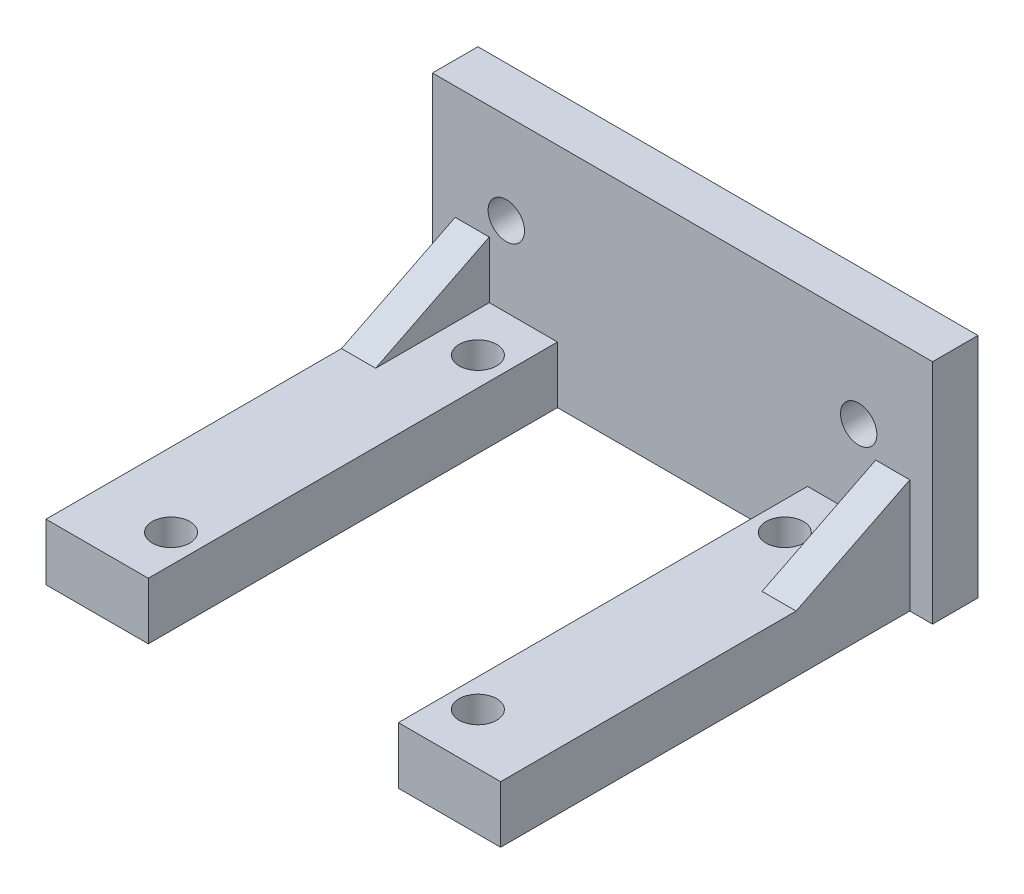
ISO-10303-21;
HEADER;
FILE_DESCRIPTION(('STEP AP214'),'2;1');
FILE_NAME('part.step','',(''),(''),'','','');
FILE_SCHEMA(('AUTOMOTIVE_DESIGN { 1 0 10303 214 1 1 1 1 }'));
ENDSEC;
DATA;
#1=APPLICATION_CONTEXT('core data for automotive mechanical design processes');
#2=APPLICATION_PROTOCOL_DEFINITION('international standard','automotive_design',2000,#1);
#3=PRODUCT_CONTEXT('',#1,'mechanical');
#4=PRODUCT('Part','Part','',(#3));
#5=PRODUCT_RELATED_PRODUCT_CATEGORY('part','',(#4));
#6=PRODUCT_DEFINITION_FORMATION('','',#4);
#7=PRODUCT_DEFINITION_CONTEXT('part definition',#1,'design');
#8=PRODUCT_DEFINITION('design','',#6,#7);
#9=PRODUCT_DEFINITION_SHAPE('','',#8);
#10=(LENGTH_UNIT() NAMED_UNIT(*) SI_UNIT(.MILLI.,.METRE.));
#11=(NAMED_UNIT(*) PLANE_ANGLE_UNIT() SI_UNIT($,.RADIAN.));
#12=(NAMED_UNIT(*) SI_UNIT($,.STERADIAN.) SOLID_ANGLE_UNIT());
#13=UNCERTAINTY_MEASURE_WITH_UNIT(LENGTH_MEASURE(1.E-05),#10,'distance_accuracy_value','');
#14=(GEOMETRIC_REPRESENTATION_CONTEXT(3) GLOBAL_UNCERTAINTY_ASSIGNED_CONTEXT((#13)) GLOBAL_UNIT_ASSIGNED_CONTEXT((#10,
#11,#12)) REPRESENTATION_CONTEXT('',''));
#15=CARTESIAN_POINT('',(0.,0.,0.));
#16=DIRECTION('',(0.,0.,1.));
#17=DIRECTION('',(1.,0.,0.));
#18=AXIS2_PLACEMENT_3D('',#15,#16,#17);
#19=CARTESIAN_POINT('',(-11.,5.,-16.));
#20=DIRECTION('',(0.,0.,-1.));
#21=DIRECTION('',(-1.,0.,0.));
#22=AXIS2_PLACEMENT_3D('',#19,#20,#21);
#23=PLANE('',#22);
#24=CARTESIAN_POINT('',(15.5,12.,-16.));
#25=DIRECTION('',(0.,0.,-1.));
#26=DIRECTION('',(-1.,0.,0.));
#27=AXIS2_PLACEMENT_3D('',#24,#25,#26);
#28=CIRCLE('',#27,1.6);
#29=CARTESIAN_POINT('',(13.9,12.,-16.));
#30=VERTEX_POINT('',#29);
#31=EDGE_CURVE('E192',#30,#30,#28,.T.);
#32=ORIENTED_EDGE('',*,*,#31,.T.);
#33=EDGE_LOOP('',(#32));
#34=FACE_BOUND('',#33,.T.);
#35=CARTESIAN_POINT('',(-15.5,12.,-16.));
#36=DIRECTION('',(0.,0.,-1.));
#37=DIRECTION('',(1.,0.,0.));
#38=AXIS2_PLACEMENT_3D('',#35,#36,#37);
#39=CIRCLE('',#38,1.6);
#40=CARTESIAN_POINT('',(-13.9,12.,-16.));
#41=VERTEX_POINT('',#40);
#42=EDGE_CURVE('E186',#41,#41,#39,.T.);
#43=ORIENTED_EDGE('',*,*,#42,.T.);
#44=EDGE_LOOP('',(#43));
#45=FACE_BOUND('',#44,.T.);
#46=DIRECTION('',(0.,-1.,0.));
#47=VECTOR('',#46,1.);
#48=CARTESIAN_POINT('',(-17.,10.,-16.));
#49=LINE('',#48,#47);
#50=CARTESIAN_POINT('',(-17.,10.,-16.));
#51=VERTEX_POINT('',#50);
#52=CARTESIAN_POINT('',(-17.,5.,-16.));
#53=VERTEX_POINT('',#52);
#54=EDGE_CURVE('E151',#51,#53,#49,.T.);
#55=ORIENTED_EDGE('',*,*,#54,.T.);
#56=DIRECTION('',(1.,0.,0.));
#57=VECTOR('',#56,1.);
#58=CARTESIAN_POINT('',(0.,5.,-16.));
#59=LINE('',#58,#57);
#60=CARTESIAN_POINT('',(-11.,5.,-16.));
#61=VERTEX_POINT('',#60);
#62=EDGE_CURVE('E233',#53,#61,#59,.T.);
#63=ORIENTED_EDGE('',*,*,#62,.T.);
#64=DIRECTION('',(0.,-1.,0.));
#65=VECTOR('',#64,1.);
#66=CARTESIAN_POINT('',(-11.,5.,-16.));
#67=LINE('',#66,#65);
#68=CARTESIAN_POINT('',(-11.,0.,-16.));
#69=VERTEX_POINT('',#68);
#70=EDGE_CURVE('E298',#61,#69,#67,.T.);
#71=ORIENTED_EDGE('',*,*,#70,.T.);
#72=DIRECTION('',(1.,0.,0.));
#73=VECTOR('',#72,1.);
#74=CARTESIAN_POINT('',(-11.,0.,-16.));
#75=LINE('',#74,#73);
#76=CARTESIAN_POINT('',(11.,0.,-16.));
#77=VERTEX_POINT('',#76);
#78=EDGE_CURVE('E290',#69,#77,#75,.T.);
#79=ORIENTED_EDGE('',*,*,#78,.T.);
#80=DIRECTION('',(0.,-1.,0.));
#81=VECTOR('',#80,1.);
#82=CARTESIAN_POINT('',(11.,5.,-16.));
#83=LINE('',#82,#81);
#84=CARTESIAN_POINT('',(11.,5.,-16.));
#85=VERTEX_POINT('',#84);
#86=EDGE_CURVE('E295',#85,#77,#83,.T.);
#87=ORIENTED_EDGE('',*,*,#86,.F.);
#88=CARTESIAN_POINT('',(17.,5.,-16.));
#89=VERTEX_POINT('',#88);
#90=EDGE_CURVE('E223',#85,#89,#59,.T.);
#91=ORIENTED_EDGE('',*,*,#90,.T.);
#92=DIRECTION('',(0.,1.,0.));
#93=VECTOR('',#92,1.);
#94=CARTESIAN_POINT('',(17.,5.,-16.));
#95=LINE('',#94,#93);
#96=CARTESIAN_POINT('',(17.,9.99999999999999,-16.));
#97=VERTEX_POINT('',#96);
#98=EDGE_CURVE('E173',#89,#97,#95,.T.);
#99=ORIENTED_EDGE('',*,*,#98,.T.);
#100=DIRECTION('',(1.,0.,0.));
#101=VECTOR('',#100,1.);
#102=CARTESIAN_POINT('',(17.,10.,-16.));
#103=LINE('',#102,#101);
#104=CARTESIAN_POINT('',(20.,10.,-16.));
#105=VERTEX_POINT('',#104);
#106=EDGE_CURVE('E179',#97,#105,#103,.T.);
#107=ORIENTED_EDGE('',*,*,#106,.T.);
#108=DIRECTION('',(0.,-1.,0.));
#109=VECTOR('',#108,1.);
#110=CARTESIAN_POINT('',(20.,5.,-16.));
#111=LINE('',#110,#109);
#112=CARTESIAN_POINT('',(20.,0.,-16.));
#113=VERTEX_POINT('',#112);
#114=EDGE_CURVE('E232',#105,#113,#111,.T.);
#115=ORIENTED_EDGE('',*,*,#114,.T.);
#116=DIRECTION('',(-1.,0.,0.));
#117=VECTOR('',#116,1.);
#118=CARTESIAN_POINT('',(22.,0.,-16.));
#119=LINE('',#118,#117);
#120=CARTESIAN_POINT('',(22.,0.,-16.));
#121=VERTEX_POINT('',#120);
#122=EDGE_CURVE('E209',#121,#113,#119,.T.);
#123=ORIENTED_EDGE('',*,*,#122,.F.);
#124=DIRECTION('',(0.,-1.,0.));
#125=VECTOR('',#124,1.);
#126=CARTESIAN_POINT('',(22.,20.,-16.));
#127=LINE('',#126,#125);
#128=CARTESIAN_POINT('',(22.,20.,-16.));
#129=VERTEX_POINT('',#128);
#130=EDGE_CURVE('E205',#129,#121,#127,.T.);
#131=ORIENTED_EDGE('',*,*,#130,.F.);
#132=DIRECTION('',(1.,0.,0.));
#133=VECTOR('',#132,1.);
#134=CARTESIAN_POINT('',(22.,20.,-16.));
#135=LINE('',#134,#133);
#136=CARTESIAN_POINT('',(-22.,20.,-16.));
#137=VERTEX_POINT('',#136);
#138=EDGE_CURVE('E201',#137,#129,#135,.T.);
#139=ORIENTED_EDGE('',*,*,#138,.F.);
#140=DIRECTION('',(0.,1.,0.));
#141=VECTOR('',#140,1.);
#142=CARTESIAN_POINT('',(-22.,20.,-16.));
#143=LINE('',#142,#141);
#144=CARTESIAN_POINT('',(-22.,0.,-16.));
#145=VERTEX_POINT('',#144);
#146=EDGE_CURVE('E198',#145,#137,#143,.T.);
#147=ORIENTED_EDGE('',*,*,#146,.F.);
#148=CARTESIAN_POINT('',(-20.,0.,-16.));
#149=VERTEX_POINT('',#148);
#150=EDGE_CURVE('E208',#149,#145,#119,.T.);
#151=ORIENTED_EDGE('',*,*,#150,.F.);
#152=DIRECTION('',(0.,1.,0.));
#153=VECTOR('',#152,1.);
#154=CARTESIAN_POINT('',(-20.,5.,-16.));
#155=LINE('',#154,#153);
#156=CARTESIAN_POINT('',(-20.,10.,-16.));
#157=VERTEX_POINT('',#156);
#158=EDGE_CURVE('E52',#149,#157,#155,.T.);
#159=ORIENTED_EDGE('',*,*,#158,.T.);
#160=DIRECTION('',(-1.,0.,0.));
#161=VECTOR('',#160,1.);
#162=CARTESIAN_POINT('',(-17.,10.,-16.));
#163=LINE('',#162,#161);
#164=EDGE_CURVE('E162',#51,#157,#163,.T.);
#165=ORIENTED_EDGE('',*,*,#164,.F.);
#166=EDGE_LOOP('',(#55,#63,#71,#79,#87,#91,#99,#107,#115,#123,#131,#139,#147,#151,#159,#165));
#167=FACE_BOUND('',#166,.T.);
#168=ADVANCED_FACE('F37',(#34,#45,#167),#23,.F.);
#169=CARTESIAN_POINT('',(0.,5.,0.));
#170=DIRECTION('',(0.,-1.,0.));
#171=DIRECTION('',(0.,0.,-1.));
#172=AXIS2_PLACEMENT_3D('',#169,#170,#171);
#173=PLANE('',#172);
#174=DIRECTION('',(0.,0.,1.));
#175=VECTOR('',#174,1.);
#176=CARTESIAN_POINT('',(-17.,5.,-16.));
#177=LINE('',#176,#175);
#178=CARTESIAN_POINT('',(-17.,5.,-6.00000000000001));
#179=VERTEX_POINT('',#178);
#180=EDGE_CURVE('E156',#53,#179,#177,.T.);
#181=ORIENTED_EDGE('',*,*,#180,.T.);
#182=DIRECTION('',(-1.,0.,0.));
#183=VECTOR('',#182,1.);
#184=CARTESIAN_POINT('',(-17.,5.,-6.00000000000001));
#185=LINE('',#184,#183);
#186=CARTESIAN_POINT('',(-20.,5.,-6.00000000000001));
#187=VERTEX_POINT('',#186);
#188=EDGE_CURVE('E164',#179,#187,#185,.T.);
#189=ORIENTED_EDGE('',*,*,#188,.T.);
#190=DIRECTION('',(0.,0.,1.));
#191=VECTOR('',#190,1.);
#192=CARTESIAN_POINT('',(-20.,5.,-20.));
#193=LINE('',#192,#191);
#194=CARTESIAN_POINT('',(-20.,5.,20.));
#195=VERTEX_POINT('',#194);
#196=EDGE_CURVE('E268',#187,#195,#193,.T.);
#197=ORIENTED_EDGE('',*,*,#196,.T.);
#198=DIRECTION('',(1.,0.,0.));
#199=VECTOR('',#198,1.);
#200=CARTESIAN_POINT('',(-20.,5.,20.));
#201=LINE('',#200,#199);
#202=CARTESIAN_POINT('',(-11.,5.,20.));
#203=VERTEX_POINT('',#202);
#204=EDGE_CURVE('E270',#195,#203,#201,.T.);
#205=ORIENTED_EDGE('',*,*,#204,.T.);
#206=DIRECTION('',(0.,0.,-1.));
#207=VECTOR('',#206,1.);
#208=CARTESIAN_POINT('',(-11.,5.,-16.));
#209=LINE('',#208,#207);
#210=EDGE_CURVE('E272',#203,#61,#209,.T.);
#211=ORIENTED_EDGE('',*,*,#210,.T.);
#212=ORIENTED_EDGE('',*,*,#62,.F.);
#213=EDGE_LOOP('',(#181,#189,#197,#205,#211,#212));
#214=FACE_BOUND('',#213,.T.);
#215=CARTESIAN_POINT('',(-13.5,5.,-11.5));
#216=DIRECTION('',(0.,1.,0.));
#217=DIRECTION('',(0.,0.,-1.));
#218=AXIS2_PLACEMENT_3D('',#215,#216,#217);
#219=CIRCLE('',#218,1.65);
#220=CARTESIAN_POINT('',(-13.5,5.,-13.15));
#221=VERTEX_POINT('',#220);
#222=EDGE_CURVE('E237',#221,#221,#219,.T.);
#223=ORIENTED_EDGE('',*,*,#222,.F.);
#224=EDGE_LOOP('',(#223));
#225=FACE_BOUND('',#224,.T.);
#226=CARTESIAN_POINT('',(-13.5,5.,15.5));
#227=DIRECTION('',(0.,1.,0.));
#228=DIRECTION('',(0.,0.,1.));
#229=AXIS2_PLACEMENT_3D('',#226,#227,#228);
#230=CIRCLE('',#229,1.65);
#231=CARTESIAN_POINT('',(-13.5,5.,17.15));
#232=VERTEX_POINT('',#231);
#233=EDGE_CURVE('E256',#232,#232,#230,.T.);
#234=ORIENTED_EDGE('',*,*,#233,.F.);
#235=EDGE_LOOP('',(#234));
#236=FACE_BOUND('',#235,.T.);
#237=ADVANCED_FACE('F325',(#214,#225,#236),#173,.F.);
#238=CARTESIAN_POINT('',(13.5,5.,-11.5));
#239=DIRECTION('',(0.,1.,0.));
#240=DIRECTION('',(0.,0.,1.));
#241=AXIS2_PLACEMENT_3D('',#238,#239,#240);
#242=CIRCLE('',#241,1.65);
#243=CARTESIAN_POINT('',(13.5,5.,-9.85));
#244=VERTEX_POINT('',#243);
#245=EDGE_CURVE('E244',#244,#244,#242,.T.);
#246=ORIENTED_EDGE('',*,*,#245,.F.);
#247=EDGE_LOOP('',(#246));
#248=FACE_BOUND('',#247,.T.);
#249=CARTESIAN_POINT('',(13.5,5.,15.5));
#250=DIRECTION('',(0.,1.,0.));
#251=DIRECTION('',(0.,0.,-1.));
#252=AXIS2_PLACEMENT_3D('',#249,#250,#251);
#253=CIRCLE('',#252,1.65);
#254=CARTESIAN_POINT('',(13.5,5.,13.85));
#255=VERTEX_POINT('',#254);
#256=EDGE_CURVE('E250',#255,#255,#253,.T.);
#257=ORIENTED_EDGE('',*,*,#256,.F.);
#258=EDGE_LOOP('',(#257));
#259=FACE_BOUND('',#258,.T.);
#260=DIRECTION('',(0.,0.,-1.));
#261=VECTOR('',#260,1.);
#262=CARTESIAN_POINT('',(20.,5.,-20.));
#263=LINE('',#262,#261);
#264=CARTESIAN_POINT('',(20.,5.,20.));
#265=VERTEX_POINT('',#264);
#266=CARTESIAN_POINT('',(20.,5.,-6.00000000000001));
#267=VERTEX_POINT('',#266);
#268=EDGE_CURVE('E265',#265,#267,#263,.T.);
#269=ORIENTED_EDGE('',*,*,#268,.T.);
#270=DIRECTION('',(1.,0.,0.));
#271=VECTOR('',#270,1.);
#272=CARTESIAN_POINT('',(17.,5.,-6.00000000000001));
#273=LINE('',#272,#271);
#274=CARTESIAN_POINT('',(17.,5.,-6.00000000000001));
#275=VERTEX_POINT('',#274);
#276=EDGE_CURVE('E60',#275,#267,#273,.T.);
#277=ORIENTED_EDGE('',*,*,#276,.F.);
#278=DIRECTION('',(0.,0.,-1.));
#279=VECTOR('',#278,1.);
#280=CARTESIAN_POINT('',(17.,5.,-6.00000000000001));
#281=LINE('',#280,#279);
#282=EDGE_CURVE('E177',#275,#89,#281,.T.);
#283=ORIENTED_EDGE('',*,*,#282,.T.);
#284=ORIENTED_EDGE('',*,*,#90,.F.);
#285=DIRECTION('',(0.,0.,1.));
#286=VECTOR('',#285,1.);
#287=CARTESIAN_POINT('',(11.,5.,-16.));
#288=LINE('',#287,#286);
#289=CARTESIAN_POINT('',(11.,5.,20.));
#290=VERTEX_POINT('',#289);
#291=EDGE_CURVE('E275',#85,#290,#288,.T.);
#292=ORIENTED_EDGE('',*,*,#291,.T.);
#293=DIRECTION('',(1.,0.,0.));
#294=VECTOR('',#293,1.);
#295=CARTESIAN_POINT('',(11.,5.,20.));
#296=LINE('',#295,#294);
#297=EDGE_CURVE('E262',#290,#265,#296,.T.);
#298=ORIENTED_EDGE('',*,*,#297,.T.);
#299=EDGE_LOOP('',(#269,#277,#283,#284,#292,#298));
#300=FACE_BOUND('',#299,.T.);
#301=ADVANCED_FACE('F336',(#248,#259,#300),#173,.F.);
#302=CARTESIAN_POINT('',(20.,5.,-20.));
#303=DIRECTION('',(-1.,0.,0.));
#304=DIRECTION('',(0.,0.,1.));
#305=AXIS2_PLACEMENT_3D('',#302,#303,#304);
#306=PLANE('',#305);
#307=ORIENTED_EDGE('',*,*,#114,.F.);
#308=DIRECTION('',(0.,-0.447213595499958,0.894427190999916));
#309=VECTOR('',#308,1.);
#310=CARTESIAN_POINT('',(20.,10.,-16.));
#311=LINE('',#310,#309);
#312=EDGE_CURVE('E168',#105,#267,#311,.T.);
#313=ORIENTED_EDGE('',*,*,#312,.T.);
#314=ORIENTED_EDGE('',*,*,#268,.F.);
#315=DIRECTION('',(0.,-1.,0.));
#316=VECTOR('',#315,1.);
#317=CARTESIAN_POINT('',(20.,5.,20.));
#318=LINE('',#317,#316);
#319=CARTESIAN_POINT('',(20.,0.,20.));
#320=VERTEX_POINT('',#319);
#321=EDGE_CURVE('E11',#265,#320,#318,.T.);
#322=ORIENTED_EDGE('',*,*,#321,.T.);
#323=DIRECTION('',(0.,0.,-1.));
#324=VECTOR('',#323,1.);
#325=CARTESIAN_POINT('',(20.,0.,-20.));
#326=LINE('',#325,#324);
#327=EDGE_CURVE('E280',#320,#113,#326,.T.);
#328=ORIENTED_EDGE('',*,*,#327,.T.);
#329=EDGE_LOOP('',(#307,#313,#314,#322,#328));
#330=FACE_BOUND('',#329,.T.);
#331=ADVANCED_FACE('F329',(#330),#306,.F.);
#332=CARTESIAN_POINT('',(-20.,5.,-20.));
#333=DIRECTION('',(1.,0.,0.));
#334=DIRECTION('',(0.,0.,-1.));
#335=AXIS2_PLACEMENT_3D('',#332,#333,#334);
#336=PLANE('',#335);
#337=DIRECTION('',(0.,-1.,0.));
#338=VECTOR('',#337,1.);
#339=CARTESIAN_POINT('',(-20.,5.,20.));
#340=LINE('',#339,#338);
#341=CARTESIAN_POINT('',(-20.,0.,20.));
#342=VERTEX_POINT('',#341);
#343=EDGE_CURVE('E45',#195,#342,#340,.T.);
#344=ORIENTED_EDGE('',*,*,#343,.F.);
#345=ORIENTED_EDGE('',*,*,#196,.F.);
#346=DIRECTION('',(0.,0.447213595499958,-0.894427190999916));
#347=VECTOR('',#346,1.);
#348=CARTESIAN_POINT('',(-20.,5.,-6.00000000000001));
#349=LINE('',#348,#347);
#350=EDGE_CURVE('E165',#187,#157,#349,.T.);
#351=ORIENTED_EDGE('',*,*,#350,.T.);
#352=ORIENTED_EDGE('',*,*,#158,.F.);
#353=DIRECTION('',(0.,0.,1.));
#354=VECTOR('',#353,1.);
#355=CARTESIAN_POINT('',(-20.,0.,-20.));
#356=LINE('',#355,#354);
#357=EDGE_CURVE('E284',#149,#342,#356,.T.);
#358=ORIENTED_EDGE('',*,*,#357,.T.);
#359=EDGE_LOOP('',(#344,#345,#351,#352,#358));
#360=FACE_BOUND('',#359,.T.);
#361=ADVANCED_FACE('F327',(#360),#336,.F.);
#362=CARTESIAN_POINT('',(0.,0.,0.));
#363=DIRECTION('',(0.,-1.,0.));
#364=DIRECTION('',(0.,0.,-1.));
#365=AXIS2_PLACEMENT_3D('',#362,#363,#364);
#366=PLANE('',#365);
#367=ORIENTED_EDGE('',*,*,#357,.F.);
#368=ORIENTED_EDGE('',*,*,#150,.T.);
#369=DIRECTION('',(0.,0.,-1.));
#370=VECTOR('',#369,1.);
#371=CARTESIAN_POINT('',(-22.,0.,-16.));
#372=LINE('',#371,#370);
#373=CARTESIAN_POINT('',(-22.,0.,-20.));
#374=VERTEX_POINT('',#373);
#375=EDGE_CURVE('E220',#145,#374,#372,.T.);
#376=ORIENTED_EDGE('',*,*,#375,.T.);
#377=DIRECTION('',(-1.,0.,0.));
#378=VECTOR('',#377,1.);
#379=CARTESIAN_POINT('',(-20.,0.,-20.));
#380=LINE('',#379,#378);
#381=CARTESIAN_POINT('',(22.,0.,-20.));
#382=VERTEX_POINT('',#381);
#383=EDGE_CURVE('E282',#382,#374,#380,.T.);
#384=ORIENTED_EDGE('',*,*,#383,.F.);
#385=DIRECTION('',(0.,0.,-1.));
#386=VECTOR('',#385,1.);
#387=CARTESIAN_POINT('',(22.,0.,-16.));
#388=LINE('',#387,#386);
#389=EDGE_CURVE('E224',#121,#382,#388,.T.);
#390=ORIENTED_EDGE('',*,*,#389,.F.);
#391=ORIENTED_EDGE('',*,*,#122,.T.);
#392=ORIENTED_EDGE('',*,*,#327,.F.);
#393=DIRECTION('',(1.,0.,0.));
#394=VECTOR('',#393,1.);
#395=CARTESIAN_POINT('',(11.,0.,20.));
#396=LINE('',#395,#394);
#397=CARTESIAN_POINT('',(11.,0.,20.));
#398=VERTEX_POINT('',#397);
#399=EDGE_CURVE('E259',#398,#320,#396,.T.);
#400=ORIENTED_EDGE('',*,*,#399,.F.);
#401=DIRECTION('',(0.,0.,1.));
#402=VECTOR('',#401,1.);
#403=CARTESIAN_POINT('',(11.,0.,-16.));
#404=LINE('',#403,#402);
#405=EDGE_CURVE('E266',#77,#398,#404,.T.);
#406=ORIENTED_EDGE('',*,*,#405,.F.);
#407=ORIENTED_EDGE('',*,*,#78,.F.);
#408=DIRECTION('',(0.,0.,-1.));
#409=VECTOR('',#408,1.);
#410=CARTESIAN_POINT('',(-11.,0.,-16.));
#411=LINE('',#410,#409);
#412=CARTESIAN_POINT('',(-11.,0.,20.));
#413=VERTEX_POINT('',#412);
#414=EDGE_CURVE('E288',#413,#69,#411,.T.);
#415=ORIENTED_EDGE('',*,*,#414,.F.);
#416=DIRECTION('',(1.,0.,0.));
#417=VECTOR('',#416,1.);
#418=CARTESIAN_POINT('',(-20.,0.,20.));
#419=LINE('',#418,#417);
#420=EDGE_CURVE('E286',#342,#413,#419,.T.);
#421=ORIENTED_EDGE('',*,*,#420,.F.);
#422=EDGE_LOOP('',(#367,#368,#376,#384,#390,#391,#392,#400,#406,#407,#415,#421));
#423=FACE_BOUND('',#422,.T.);
#424=CARTESIAN_POINT('',(13.5,0.,15.5));
#425=DIRECTION('',(0.,1.,0.));
#426=DIRECTION('',(0.,0.,-1.));
#427=AXIS2_PLACEMENT_3D('',#424,#425,#426);
#428=CIRCLE('',#427,1.65);
#429=CARTESIAN_POINT('',(13.5,0.,13.85));
#430=VERTEX_POINT('',#429);
#431=EDGE_CURVE('E247',#430,#430,#428,.T.);
#432=ORIENTED_EDGE('',*,*,#431,.T.);
#433=EDGE_LOOP('',(#432));
#434=FACE_BOUND('',#433,.T.);
#435=CARTESIAN_POINT('',(13.5,0.,-11.5));
#436=DIRECTION('',(0.,1.,0.));
#437=DIRECTION('',(0.,0.,1.));
#438=AXIS2_PLACEMENT_3D('',#435,#436,#437);
#439=CIRCLE('',#438,1.65);
#440=CARTESIAN_POINT('',(13.5,0.,-9.85));
#441=VERTEX_POINT('',#440);
#442=EDGE_CURVE('E240',#441,#441,#439,.T.);
#443=ORIENTED_EDGE('',*,*,#442,.T.);
#444=EDGE_LOOP('',(#443));
#445=FACE_BOUND('',#444,.T.);
#446=CARTESIAN_POINT('',(-13.5,0.,15.5));
#447=DIRECTION('',(0.,1.,0.));
#448=DIRECTION('',(0.,0.,1.));
#449=AXIS2_PLACEMENT_3D('',#446,#447,#448);
#450=CIRCLE('',#449,1.65);
#451=CARTESIAN_POINT('',(-13.5,0.,17.15));
#452=VERTEX_POINT('',#451);
#453=EDGE_CURVE('E253',#452,#452,#450,.T.);
#454=ORIENTED_EDGE('',*,*,#453,.T.);
#455=EDGE_LOOP('',(#454));
#456=FACE_BOUND('',#455,.T.);
#457=CARTESIAN_POINT('',(-13.5,0.,-11.5));
#458=DIRECTION('',(0.,1.,0.));
#459=DIRECTION('',(0.,0.,-1.));
#460=AXIS2_PLACEMENT_3D('',#457,#458,#459);
#461=CIRCLE('',#460,1.65);
#462=CARTESIAN_POINT('',(-13.5,0.,-13.15));
#463=VERTEX_POINT('',#462);
#464=EDGE_CURVE('E241',#463,#463,#461,.T.);
#465=ORIENTED_EDGE('',*,*,#464,.T.);
#466=EDGE_LOOP('',(#465));
#467=FACE_BOUND('',#466,.T.);
#468=ADVANCED_FACE('F315',(#423,#434,#445,#456,#467),#366,.T.);
#469=CARTESIAN_POINT('',(11.,5.,20.));
#470=DIRECTION('',(0.,0.,-1.));
#471=DIRECTION('',(-1.,0.,0.));
#472=AXIS2_PLACEMENT_3D('',#469,#470,#471);
#473=PLANE('',#472);
#474=ORIENTED_EDGE('',*,*,#399,.T.);
#475=ORIENTED_EDGE('',*,*,#321,.F.);
#476=ORIENTED_EDGE('',*,*,#297,.F.);
#477=DIRECTION('',(0.,-1.,0.));
#478=VECTOR('',#477,1.);
#479=CARTESIAN_POINT('',(11.,5.,20.));
#480=LINE('',#479,#478);
#481=EDGE_CURVE('E277',#290,#398,#480,.T.);
#482=ORIENTED_EDGE('',*,*,#481,.T.);
#483=EDGE_LOOP('',(#474,#475,#476,#482));
#484=FACE_BOUND('',#483,.T.);
#485=ADVANCED_FACE('F39',(#484),#473,.F.);
#486=CARTESIAN_POINT('',(-20.,5.,-20.));
#487=DIRECTION('',(0.,0.,1.));
#488=DIRECTION('',(1.,0.,0.));
#489=AXIS2_PLACEMENT_3D('',#486,#487,#488);
#490=PLANE('',#489);
#491=DIRECTION('',(0.,-1.,0.));
#492=VECTOR('',#491,1.);
#493=CARTESIAN_POINT('',(22.,20.,-20.));
#494=LINE('',#493,#492);
#495=CARTESIAN_POINT('',(22.,20.,-20.));
#496=VERTEX_POINT('',#495);
#497=EDGE_CURVE('E202',#496,#382,#494,.T.);
#498=ORIENTED_EDGE('',*,*,#497,.T.);
#499=ORIENTED_EDGE('',*,*,#383,.T.);
#500=DIRECTION('',(0.,1.,0.));
#501=VECTOR('',#500,1.);
#502=CARTESIAN_POINT('',(-22.,20.,-20.));
#503=LINE('',#502,#501);
#504=CARTESIAN_POINT('',(-22.,20.,-20.));
#505=VERTEX_POINT('',#504);
#506=EDGE_CURVE('E195',#374,#505,#503,.T.);
#507=ORIENTED_EDGE('',*,*,#506,.T.);
#508=DIRECTION('',(1.,0.,0.));
#509=VECTOR('',#508,1.);
#510=CARTESIAN_POINT('',(22.,20.,-20.));
#511=LINE('',#510,#509);
#512=EDGE_CURVE('E215',#505,#496,#511,.T.);
#513=ORIENTED_EDGE('',*,*,#512,.T.);
#514=EDGE_LOOP('',(#498,#499,#507,#513));
#515=FACE_BOUND('',#514,.T.);
#516=CARTESIAN_POINT('',(15.5,12.,-20.));
#517=DIRECTION('',(0.,0.,-1.));
#518=DIRECTION('',(-1.,0.,0.));
#519=AXIS2_PLACEMENT_3D('',#516,#517,#518);
#520=CIRCLE('',#519,1.6);
#521=CARTESIAN_POINT('',(13.9,12.,-20.));
#522=VERTEX_POINT('',#521);
#523=EDGE_CURVE('E189',#522,#522,#520,.T.);
#524=ORIENTED_EDGE('',*,*,#523,.F.);
#525=EDGE_LOOP('',(#524));
#526=FACE_BOUND('',#525,.T.);
#527=CARTESIAN_POINT('',(-15.5,12.,-20.));
#528=DIRECTION('',(0.,0.,-1.));
#529=DIRECTION('',(1.,0.,0.));
#530=AXIS2_PLACEMENT_3D('',#527,#528,#529);
#531=CIRCLE('',#530,1.6);
#532=CARTESIAN_POINT('',(-13.9,12.,-20.));
#533=VERTEX_POINT('',#532);
#534=EDGE_CURVE('E183',#533,#533,#531,.T.);
#535=ORIENTED_EDGE('',*,*,#534,.F.);
#536=EDGE_LOOP('',(#535));
#537=FACE_BOUND('',#536,.T.);
#538=ADVANCED_FACE('F353',(#515,#526,#537),#490,.F.);
#539=CARTESIAN_POINT('',(-20.,5.,20.));
#540=DIRECTION('',(0.,0.,-1.));
#541=DIRECTION('',(-1.,0.,0.));
#542=AXIS2_PLACEMENT_3D('',#539,#540,#541);
#543=PLANE('',#542);
#544=ORIENTED_EDGE('',*,*,#420,.T.);
#545=DIRECTION('',(0.,-1.,0.));
#546=VECTOR('',#545,1.);
#547=CARTESIAN_POINT('',(-11.,5.,20.));
#548=LINE('',#547,#546);
#549=EDGE_CURVE('E301',#203,#413,#548,.T.);
#550=ORIENTED_EDGE('',*,*,#549,.F.);
#551=ORIENTED_EDGE('',*,*,#204,.F.);
#552=ORIENTED_EDGE('',*,*,#343,.T.);
#553=EDGE_LOOP('',(#544,#550,#551,#552));
#554=FACE_BOUND('',#553,.T.);
#555=ADVANCED_FACE('F308',(#554),#543,.F.);
#556=CARTESIAN_POINT('',(-11.,5.,-16.));
#557=DIRECTION('',(-1.,0.,0.));
#558=DIRECTION('',(0.,0.,1.));
#559=AXIS2_PLACEMENT_3D('',#556,#557,#558);
#560=PLANE('',#559);
#561=ORIENTED_EDGE('',*,*,#414,.T.);
#562=ORIENTED_EDGE('',*,*,#70,.F.);
#563=ORIENTED_EDGE('',*,*,#210,.F.);
#564=ORIENTED_EDGE('',*,*,#549,.T.);
#565=EDGE_LOOP('',(#561,#562,#563,#564));
#566=FACE_BOUND('',#565,.T.);
#567=ADVANCED_FACE('F321',(#566),#560,.F.);
#568=CARTESIAN_POINT('',(11.,5.,-16.));
#569=DIRECTION('',(1.,0.,0.));
#570=DIRECTION('',(0.,0.,-1.));
#571=AXIS2_PLACEMENT_3D('',#568,#569,#570);
#572=PLANE('',#571);
#573=ORIENTED_EDGE('',*,*,#405,.T.);
#574=ORIENTED_EDGE('',*,*,#481,.F.);
#575=ORIENTED_EDGE('',*,*,#291,.F.);
#576=ORIENTED_EDGE('',*,*,#86,.T.);
#577=EDGE_LOOP('',(#573,#574,#575,#576));
#578=FACE_BOUND('',#577,.T.);
#579=ADVANCED_FACE('F350',(#578),#572,.F.);
#580=CARTESIAN_POINT('',(-13.5,5.,15.5));
#581=DIRECTION('',(0.,-1.,0.));
#582=DIRECTION('',(0.,0.,-1.));
#583=AXIS2_PLACEMENT_3D('',#580,#581,#582);
#584=CYLINDRICAL_SURFACE('',#583,1.65);
#585=ORIENTED_EDGE('',*,*,#233,.T.);
#586=EDGE_LOOP('',(#585));
#587=FACE_BOUND('',#586,.T.);
#588=ORIENTED_EDGE('',*,*,#453,.F.);
#589=EDGE_LOOP('',(#588));
#590=FACE_BOUND('',#589,.T.);
#591=ADVANCED_FACE('F409',(#587,#590),#584,.F.);
#592=CARTESIAN_POINT('',(13.5,5.,15.5));
#593=DIRECTION('',(0.,-1.,0.));
#594=DIRECTION('',(0.,0.,-1.));
#595=AXIS2_PLACEMENT_3D('',#592,#593,#594);
#596=CYLINDRICAL_SURFACE('',#595,1.65);
#597=ORIENTED_EDGE('',*,*,#256,.T.);
#598=EDGE_LOOP('',(#597));
#599=FACE_BOUND('',#598,.T.);
#600=ORIENTED_EDGE('',*,*,#431,.F.);
#601=EDGE_LOOP('',(#600));
#602=FACE_BOUND('',#601,.T.);
#603=ADVANCED_FACE('F405',(#599,#602),#596,.F.);
#604=CARTESIAN_POINT('',(13.5,5.,-11.5));
#605=DIRECTION('',(0.,-1.,0.));
#606=DIRECTION('',(0.,0.,-1.));
#607=AXIS2_PLACEMENT_3D('',#604,#605,#606);
#608=CYLINDRICAL_SURFACE('',#607,1.65);
#609=ORIENTED_EDGE('',*,*,#245,.T.);
#610=EDGE_LOOP('',(#609));
#611=FACE_BOUND('',#610,.T.);
#612=ORIENTED_EDGE('',*,*,#442,.F.);
#613=EDGE_LOOP('',(#612));
#614=FACE_BOUND('',#613,.T.);
#615=ADVANCED_FACE('F401',(#611,#614),#608,.F.);
#616=CARTESIAN_POINT('',(-13.5,5.,-11.5));
#617=DIRECTION('',(0.,-1.,0.));
#618=DIRECTION('',(0.,0.,-1.));
#619=AXIS2_PLACEMENT_3D('',#616,#617,#618);
#620=CYLINDRICAL_SURFACE('',#619,1.65);
#621=ORIENTED_EDGE('',*,*,#222,.T.);
#622=EDGE_LOOP('',(#621));
#623=FACE_BOUND('',#622,.T.);
#624=ORIENTED_EDGE('',*,*,#464,.F.);
#625=EDGE_LOOP('',(#624));
#626=FACE_BOUND('',#625,.T.);
#627=ADVANCED_FACE('F397',(#623,#626),#620,.F.);
#628=CARTESIAN_POINT('',(-22.,20.,-16.));
#629=DIRECTION('',(-1.,0.,0.));
#630=DIRECTION('',(0.,-1.,0.));
#631=AXIS2_PLACEMENT_3D('',#628,#629,#630);
#632=PLANE('',#631);
#633=ORIENTED_EDGE('',*,*,#506,.F.);
#634=ORIENTED_EDGE('',*,*,#375,.F.);
#635=ORIENTED_EDGE('',*,*,#146,.T.);
#636=DIRECTION('',(0.,0.,-1.));
#637=VECTOR('',#636,1.);
#638=CARTESIAN_POINT('',(-22.,20.,-16.));
#639=LINE('',#638,#637);
#640=EDGE_CURVE('E212',#137,#505,#639,.T.);
#641=ORIENTED_EDGE('',*,*,#640,.T.);
#642=EDGE_LOOP('',(#633,#634,#635,#641));
#643=FACE_BOUND('',#642,.T.);
#644=ADVANCED_FACE('F390',(#643),#632,.T.);
#645=CARTESIAN_POINT('',(22.,20.,-16.));
#646=DIRECTION('',(1.,0.,0.));
#647=DIRECTION('',(0.,1.,0.));
#648=AXIS2_PLACEMENT_3D('',#645,#646,#647);
#649=PLANE('',#648);
#650=ORIENTED_EDGE('',*,*,#497,.F.);
#651=DIRECTION('',(0.,0.,-1.));
#652=VECTOR('',#651,1.);
#653=CARTESIAN_POINT('',(22.,20.,-16.));
#654=LINE('',#653,#652);
#655=EDGE_CURVE('E227',#129,#496,#654,.T.);
#656=ORIENTED_EDGE('',*,*,#655,.F.);
#657=ORIENTED_EDGE('',*,*,#130,.T.);
#658=ORIENTED_EDGE('',*,*,#389,.T.);
#659=EDGE_LOOP('',(#650,#656,#657,#658));
#660=FACE_BOUND('',#659,.T.);
#661=ADVANCED_FACE('F387',(#660),#649,.T.);
#662=CARTESIAN_POINT('',(22.,20.,-16.));
#663=DIRECTION('',(0.,1.,0.));
#664=DIRECTION('',(0.,0.,1.));
#665=AXIS2_PLACEMENT_3D('',#662,#663,#664);
#666=PLANE('',#665);
#667=ORIENTED_EDGE('',*,*,#512,.F.);
#668=ORIENTED_EDGE('',*,*,#640,.F.);
#669=ORIENTED_EDGE('',*,*,#138,.T.);
#670=ORIENTED_EDGE('',*,*,#655,.T.);
#671=EDGE_LOOP('',(#667,#668,#669,#670));
#672=FACE_BOUND('',#671,.T.);
#673=ADVANCED_FACE('F381',(#672),#666,.T.);
#674=CARTESIAN_POINT('',(15.5,12.,-16.));
#675=DIRECTION('',(0.,0.,-1.));
#676=DIRECTION('',(-1.,0.,0.));
#677=AXIS2_PLACEMENT_3D('',#674,#675,#676);
#678=CYLINDRICAL_SURFACE('',#677,1.6);
#679=ORIENTED_EDGE('',*,*,#31,.F.);
#680=EDGE_LOOP('',(#679));
#681=FACE_BOUND('',#680,.T.);
#682=ORIENTED_EDGE('',*,*,#523,.T.);
#683=EDGE_LOOP('',(#682));
#684=FACE_BOUND('',#683,.T.);
#685=ADVANCED_FACE('F371',(#681,#684),#678,.F.);
#686=CARTESIAN_POINT('',(-15.5,12.,-16.));
#687=DIRECTION('',(0.,0.,-1.));
#688=DIRECTION('',(-1.,0.,0.));
#689=AXIS2_PLACEMENT_3D('',#686,#687,#688);
#690=CYLINDRICAL_SURFACE('',#689,1.6);
#691=ORIENTED_EDGE('',*,*,#42,.F.);
#692=EDGE_LOOP('',(#691));
#693=FACE_BOUND('',#692,.T.);
#694=ORIENTED_EDGE('',*,*,#534,.T.);
#695=EDGE_LOOP('',(#694));
#696=FACE_BOUND('',#695,.T.);
#697=ADVANCED_FACE('F368',(#693,#696),#690,.F.);
#698=CARTESIAN_POINT('',(17.,10.,-16.));
#699=DIRECTION('',(0.,0.894427190999916,0.447213595499958));
#700=DIRECTION('',(0.,-0.447213595499958,0.894427190999916));
#701=AXIS2_PLACEMENT_3D('',#698,#699,#700);
#702=PLANE('',#701);
#703=ORIENTED_EDGE('',*,*,#312,.F.);
#704=ORIENTED_EDGE('',*,*,#106,.F.);
#705=DIRECTION('',(0.,-0.447213595499958,0.894427190999916));
#706=VECTOR('',#705,1.);
#707=CARTESIAN_POINT('',(17.,10.,-16.));
#708=LINE('',#707,#706);
#709=EDGE_CURVE('E175',#97,#275,#708,.T.);
#710=ORIENTED_EDGE('',*,*,#709,.T.);
#711=ORIENTED_EDGE('',*,*,#276,.T.);
#712=EDGE_LOOP('',(#703,#704,#710,#711));
#713=FACE_BOUND('',#712,.T.);
#714=ADVANCED_FACE('F370',(#713),#702,.T.);
#715=CARTESIAN_POINT('',(17.,0.,0.));
#716=DIRECTION('',(-1.,0.,0.));
#717=DIRECTION('',(0.,0.,1.));
#718=AXIS2_PLACEMENT_3D('',#715,#716,#717);
#719=PLANE('',#718);
#720=ORIENTED_EDGE('',*,*,#98,.F.);
#721=ORIENTED_EDGE('',*,*,#282,.F.);
#722=ORIENTED_EDGE('',*,*,#709,.F.);
#723=EDGE_LOOP('',(#720,#721,#722));
#724=FACE_BOUND('',#723,.T.);
#725=ADVANCED_FACE('F378',(#724),#719,.T.);
#726=CARTESIAN_POINT('',(-17.,5.,-6.00000000000001));
#727=DIRECTION('',(0.,0.894427190999916,0.447213595499958));
#728=DIRECTION('',(0.,-0.447213595499958,0.894427190999916));
#729=AXIS2_PLACEMENT_3D('',#726,#727,#728);
#730=PLANE('',#729);
#731=ORIENTED_EDGE('',*,*,#350,.F.);
#732=ORIENTED_EDGE('',*,*,#188,.F.);
#733=DIRECTION('',(0.,0.447213595499958,-0.894427190999916));
#734=VECTOR('',#733,1.);
#735=CARTESIAN_POINT('',(-17.,5.,-6.00000000000001));
#736=LINE('',#735,#734);
#737=EDGE_CURVE('E154',#179,#51,#736,.T.);
#738=ORIENTED_EDGE('',*,*,#737,.T.);
#739=ORIENTED_EDGE('',*,*,#164,.T.);
#740=EDGE_LOOP('',(#731,#732,#738,#739));
#741=FACE_BOUND('',#740,.T.);
#742=ADVANCED_FACE('F161',(#741),#730,.T.);
#743=CARTESIAN_POINT('',(-17.,0.,0.));
#744=DIRECTION('',(-1.,0.,0.));
#745=DIRECTION('',(0.,0.,1.));
#746=AXIS2_PLACEMENT_3D('',#743,#744,#745);
#747=PLANE('',#746);
#748=ORIENTED_EDGE('',*,*,#737,.F.);
#749=ORIENTED_EDGE('',*,*,#180,.F.);
#750=ORIENTED_EDGE('',*,*,#54,.F.);
#751=EDGE_LOOP('',(#748,#749,#750));
#752=FACE_BOUND('',#751,.T.);
#753=ADVANCED_FACE('F153',(#752),#747,.F.);
#754=CLOSED_SHELL('',(#168,#237,#301,#331,#361,#468,#485,#538,#555,#567,#579,#591,#603,#615,
#627,#644,#661,#673,#685,#697,#714,#725,#742,#753));
#755=MANIFOLD_SOLID_BREP('B2',#754);
#756=ADVANCED_BREP_SHAPE_REPRESENTATION('',(#18,#755),#14);
#757=SHAPE_DEFINITION_REPRESENTATION(#9,#756);
ENDSEC;
END-ISO-10303-21;
